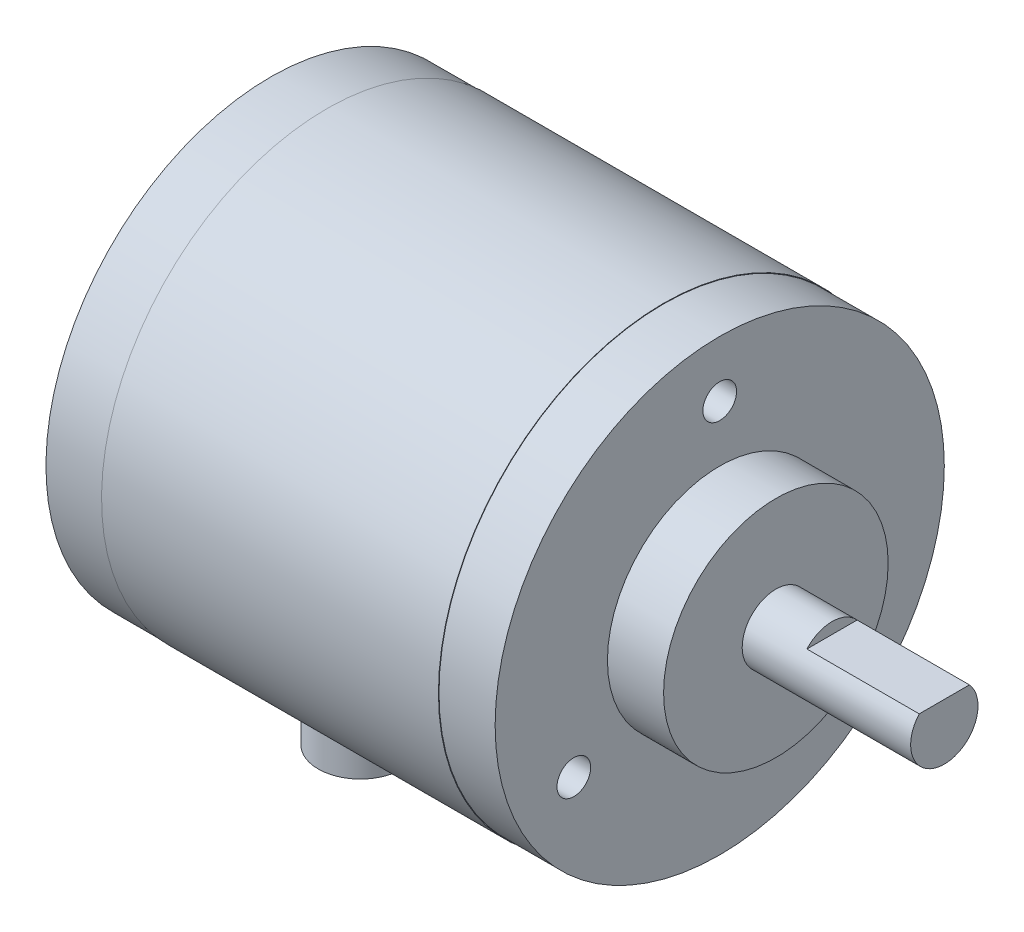
ISO-10303-21;
HEADER;
FILE_DESCRIPTION(('STEP AP214'),'2;1');
FILE_NAME('part.step','',(''),(''),'','','');
FILE_SCHEMA(('AUTOMOTIVE_DESIGN { 1 0 10303 214 1 1 1 1 }'));
ENDSEC;
DATA;
#1=APPLICATION_CONTEXT('core data for automotive mechanical design processes');
#2=APPLICATION_PROTOCOL_DEFINITION('international standard','automotive_design',2000,#1);
#3=PRODUCT_CONTEXT('',#1,'mechanical');
#4=PRODUCT('Part','Part','',(#3));
#5=PRODUCT_RELATED_PRODUCT_CATEGORY('part','',(#4));
#6=PRODUCT_DEFINITION_FORMATION('','',#4);
#7=PRODUCT_DEFINITION_CONTEXT('part definition',#1,'design');
#8=PRODUCT_DEFINITION('design','',#6,#7);
#9=PRODUCT_DEFINITION_SHAPE('','',#8);
#10=(LENGTH_UNIT() NAMED_UNIT(*) SI_UNIT(.MILLI.,.METRE.));
#11=(NAMED_UNIT(*) PLANE_ANGLE_UNIT() SI_UNIT($,.RADIAN.));
#12=(NAMED_UNIT(*) SI_UNIT($,.STERADIAN.) SOLID_ANGLE_UNIT());
#13=UNCERTAINTY_MEASURE_WITH_UNIT(LENGTH_MEASURE(1.E-05),#10,'distance_accuracy_value','');
#14=(GEOMETRIC_REPRESENTATION_CONTEXT(3) GLOBAL_UNCERTAINTY_ASSIGNED_CONTEXT((#13)) GLOBAL_UNIT_ASSIGNED_CONTEXT((#10,
#11,#12)) REPRESENTATION_CONTEXT('',''));
#15=CARTESIAN_POINT('',(0.,0.,0.));
#16=DIRECTION('',(0.,0.,1.));
#17=DIRECTION('',(1.,0.,0.));
#18=AXIS2_PLACEMENT_3D('',#15,#16,#17);
#19=CARTESIAN_POINT('',(5.,0.,0.));
#20=DIRECTION('',(1.,0.,0.));
#21=DIRECTION('',(0.,0.,-1.));
#22=AXIS2_PLACEMENT_3D('',#19,#20,#21);
#23=PLANE('',#22);
#24=DIRECTION('',(0.,-1.,0.));
#25=VECTOR('',#24,1.);
#26=CARTESIAN_POINT('',(5.,-20.,2.25));
#27=LINE('',#26,#25);
#28=CARTESIAN_POINT('',(5.,-19.9233531314385,2.25));
#29=VERTEX_POINT('',#28);
#30=CARTESIAN_POINT('',(5.,-19.8730344940072,2.25));
#31=VERTEX_POINT('',#30);
#32=EDGE_CURVE('E67',#29,#31,#27,.F.);
#33=ORIENTED_EDGE('',*,*,#32,.F.);
#34=CARTESIAN_POINT('',(5.,0.,0.));
#35=DIRECTION('',(1.,0.,0.));
#36=DIRECTION('',(0.,0.,-1.));
#37=AXIS2_PLACEMENT_3D('',#34,#35,#36);
#38=CIRCLE('',#37,20.05);
#39=CARTESIAN_POINT('',(5.,-19.9233531314385,-2.25));
#40=VERTEX_POINT('',#39);
#41=EDGE_CURVE('E91',#40,#29,#38,.T.);
#42=ORIENTED_EDGE('',*,*,#41,.F.);
#43=DIRECTION('',(0.,-1.,0.));
#44=VECTOR('',#43,1.);
#45=CARTESIAN_POINT('',(5.,-20.,-2.25));
#46=LINE('',#45,#44);
#47=CARTESIAN_POINT('',(5.,-19.8730344940072,-2.25));
#48=VERTEX_POINT('',#47);
#49=EDGE_CURVE('E90',#48,#40,#46,.T.);
#50=ORIENTED_EDGE('',*,*,#49,.F.);
#51=CARTESIAN_POINT('',(5.,0.,0.));
#52=DIRECTION('',(1.,0.,0.));
#53=DIRECTION('',(0.,0.,-1.));
#54=AXIS2_PLACEMENT_3D('',#51,#52,#53);
#55=CIRCLE('',#54,20.);
#56=EDGE_CURVE('E54',#48,#31,#55,.T.);
#57=ORIENTED_EDGE('',*,*,#56,.T.);
#58=EDGE_LOOP('',(#33,#42,#50,#57));
#59=FACE_BOUND('',#58,.T.);
#60=ADVANCED_FACE('F41',(#59),#23,.F.);
#61=CARTESIAN_POINT('',(5.,0.,0.));
#62=DIRECTION('',(1.,0.,0.));
#63=DIRECTION('',(0.,0.,-1.));
#64=AXIS2_PLACEMENT_3D('',#61,#62,#63);
#65=CYLINDRICAL_SURFACE('',#64,20.05);
#66=CARTESIAN_POINT('',(35.,0.,0.));
#67=DIRECTION('',(1.,0.,0.));
#68=DIRECTION('',(0.,0.,-1.));
#69=AXIS2_PLACEMENT_3D('',#66,#67,#68);
#70=CIRCLE('',#69,20.05);
#71=CARTESIAN_POINT('',(35.,0.,-20.05));
#72=VERTEX_POINT('',#71);
#73=EDGE_CURVE('E96',#72,#72,#70,.T.);
#74=ORIENTED_EDGE('',*,*,#73,.F.);
#75=EDGE_LOOP('',(#74));
#76=FACE_BOUND('',#75,.T.);
#77=ORIENTED_EDGE('',*,*,#41,.T.);
#78=CARTESIAN_POINT('',(5.,-19.9233531314385,2.25));
#79=CARTESIAN_POINT('',(5.06338252081339,-19.913809537772,2.33452429810005));
#80=CARTESIAN_POINT('',(5.13033387152823,-19.9040233955801,2.41633733781597));
#81=CARTESIAN_POINT('',(5.27087961171765,-19.8842463640926,2.57401230332341));
#82=CARTESIAN_POINT('',(5.34447379216963,-19.8742554812469,2.64987441622589));
#83=CARTESIAN_POINT('',(5.49780582729423,-19.8543498242708,2.79511598565796));
#84=CARTESIAN_POINT('',(5.57754297641999,-19.8444350415432,2.86449618464442));
#85=CARTESIAN_POINT('',(5.74258504125269,-19.8249637662683,2.99628859459913));
#86=CARTESIAN_POINT('',(5.82788988327751,-19.8154072689819,3.05870089774998));
#87=CARTESIAN_POINT('',(6.09143023950738,-19.7876790696918,3.23487693039896));
#88=CARTESIAN_POINT('',(6.27733408485814,-19.7704429159462,3.33761998839842));
#89=CARTESIAN_POINT('',(6.66394335913593,-19.7405148510179,3.51031519580503));
#90=CARTESIAN_POINT('',(6.8646426878523,-19.7278210794988,3.58028077289371));
#91=CARTESIAN_POINT('',(7.2735443129088,-19.7085370662539,3.68495535849222));
#92=CARTESIAN_POINT('',(7.4816690538866,-19.7018962507731,3.71995674132257));
#93=CARTESIAN_POINT('',(7.90096818712595,-19.6953261999385,3.7545909523402));
#94=CARTESIAN_POINT('',(8.11214284751298,-19.6953975583028,3.75422065176326));
#95=CARTESIAN_POINT('',(8.52840995160946,-19.7021950090889,3.71837598671436));
#96=CARTESIAN_POINT('',(8.73354613465909,-19.7088286620763,3.68338924382514));
#97=CARTESIAN_POINT('',(9.13496175001409,-19.7278461700404,3.58012769253164));
#98=CARTESIAN_POINT('',(9.33124146834608,-19.7402298391695,3.51185395999919));
#99=CARTESIAN_POINT('',(9.71046907148457,-19.7694145760612,3.34365462519373));
#100=CARTESIAN_POINT('',(9.89335046224243,-19.7862359898788,3.24358279227224));
#101=CARTESIAN_POINT('',(10.2398917650699,-19.8223955356187,3.01471639303099));
#102=CARTESIAN_POINT('',(10.4035493281158,-19.8417339744975,2.88591832211864));
#103=CARTESIAN_POINT('',(10.7097229897273,-19.8811252716766,2.60083452898006));
#104=CARTESIAN_POINT('',(10.8518633513331,-19.9011845934586,2.44414590207992));
#105=CARTESIAN_POINT('',(11.1079178301332,-19.9394854780099,2.10898579698841));
#106=CARTESIAN_POINT('',(11.221831550984,-19.9577270152526,1.93051401298209));
#107=CARTESIAN_POINT('',(11.4184199666399,-19.9904011004372,1.55618357229031));
#108=CARTESIAN_POINT('',(11.5010123671055,-20.0048235845561,1.36028075965231));
#109=CARTESIAN_POINT('',(11.632007713313,-20.0281625079482,0.957050579316482));
#110=CARTESIAN_POINT('',(11.6804141323141,-20.0370795065614,0.749724374531037));
#111=CARTESIAN_POINT('',(11.7410666399347,-20.0483090645307,0.332695237336482));
#112=CARTESIAN_POINT('',(11.7538180377609,-20.0507138997865,0.123068238703445));
#113=CARTESIAN_POINT('',(11.7442031558044,-20.0489160463769,-0.295341804181988));
#114=CARTESIAN_POINT('',(11.7218388639763,-20.0447137317528,-0.504124895538473));
#115=CARTESIAN_POINT('',(11.6430614161826,-20.0302379912467,-0.913001484824106));
#116=CARTESIAN_POINT('',(11.5869524570755,-20.0200188223739,-1.11315569436244));
#117=CARTESIAN_POINT('',(11.442637609505,-19.9946676878879,-1.50120149177764));
#118=CARTESIAN_POINT('',(11.354429782121,-19.979535425507,-1.68909233808168));
#119=CARTESIAN_POINT('',(11.1474243092731,-19.9458212585601,-2.04934284213158));
#120=CARTESIAN_POINT('',(11.0283323597312,-19.9272066736222,-2.22153025242031));
#121=CARTESIAN_POINT('',(10.7632933448893,-19.8886560989437,-2.5436635211042));
#122=CARTESIAN_POINT('',(10.6173435739289,-19.8687199762009,-2.69360713590529));
#123=CARTESIAN_POINT('',(10.3003165894505,-19.8294333593377,-2.9691330744842));
#124=CARTESIAN_POINT('',(10.1289193627797,-19.8100948000753,-3.09434923922884));
#125=CARTESIAN_POINT('',(9.76724371779164,-19.7744992585008,-3.31423198051181));
#126=CARTESIAN_POINT('',(9.57696609431597,-19.7582421465474,-3.40889984238357));
#127=CARTESIAN_POINT('',(9.18353950999636,-19.7307486025819,-3.56459350080344));
#128=CARTESIAN_POINT('',(8.98043851231735,-19.7194945962094,-3.62573723672984));
#129=CARTESIAN_POINT('',(8.56659724951088,-19.7032567003253,-3.7129738458146));
#130=CARTESIAN_POINT('',(8.35585750734706,-19.6982723824093,-3.73906911382365));
#131=CARTESIAN_POINT('',(7.93630624468577,-19.6951959686927,-3.75523882024993));
#132=CARTESIAN_POINT('',(7.72751707761229,-19.6969959213703,-3.74587743437077));
#133=CARTESIAN_POINT('',(7.31456283978339,-19.7070344679675,-3.69269696640684));
#134=CARTESIAN_POINT('',(7.1103972255991,-19.7152723011273,-3.6488819556783));
#135=CARTESIAN_POINT('',(6.71307270102733,-19.7371963545271,-3.52835409004778));
#136=CARTESIAN_POINT('',(6.51988027552968,-19.7508648374251,-3.45174827259621));
#137=CARTESIAN_POINT('',(6.1489972108003,-19.7821135121085,-3.26789627186293));
#138=CARTESIAN_POINT('',(5.97130916760373,-19.7996943572322,-3.16064497014029));
#139=CARTESIAN_POINT('',(5.65083544225344,-19.8352070966131,-2.92907698683507));
#140=CARTESIAN_POINT('',(5.50635563852822,-19.8529731360342,-2.80708025676274));
#141=CARTESIAN_POINT('',(5.30472216075853,-19.8796395231588,-2.60899927185773));
#142=CARTESIAN_POINT('',(5.24002016141443,-19.8885320184573,-2.54045102381805));
#143=CARTESIAN_POINT('',(5.11594064273755,-19.9061306695084,-2.39866038965758));
#144=CARTESIAN_POINT('',(5.05656361578336,-19.9148368079727,-2.32541757052035));
#145=CARTESIAN_POINT('',(5.,-19.9233531314385,-2.25));
#146=B_SPLINE_CURVE_WITH_KNOTS('',3,(#78,#79,#80,#81,#82,#83,#84,#85,#86,#87,#88,#89,#90,#91,
#92,#93,#94,#95,#96,#97,#98,#99,#100,#101,#102,#103,#104,#105,#106,#107,#108,#109,#110,#111,
#112,#113,#114,#115,#116,#117,#118,#119,#120,#121,#122,#123,#124,#125,#126,#127,#128,#129,#130,
#131,#132,#133,#134,#135,#136,#137,#138,#139,#140,#141,#142,#143,#144,#145),.UNSPECIFIED.,.F.,
.F.,(4,2,2,2,2,2,2,2,2,2,2,2,2,2,2,2,2,2,2,2,2,2,2,2,2,2,2,2,2,2,2,2,2,4),(0.,0.318132871892383,
0.636255736935585,0.954342118490034,1.27242429138438,1.90841449824463,2.54414393589503,
3.17451168300621,3.80493518867032,4.42660292526896,5.04825057022005,5.67279941336149,
6.29742449299743,6.93193873565257,7.56646188731279,8.2026408352407,8.83875513876541,
9.46580748318523,10.0928243304611,10.7142718224244,11.3357568589346,11.9633969702604,
12.5911003447819,13.2274972479982,13.8638673710393,14.4979841106575,15.1320575190755,
15.756084444363,16.3800376399867,17.0019694438269,17.6240051841484,18.1915158424468,
18.4753229303283,18.7591562336995),.UNSPECIFIED.);
#147=EDGE_CURVE('E60',#29,#40,#146,.T.);
#148=ORIENTED_EDGE('',*,*,#147,.T.);
#149=EDGE_LOOP('',(#77,#148));
#150=FACE_BOUND('',#149,.T.);
#151=ADVANCED_FACE('F169',(#76,#150),#65,.T.);
#152=CARTESIAN_POINT('',(40.,0.,0.));
#153=DIRECTION('',(-1.,0.,0.));
#154=DIRECTION('',(0.,0.,1.));
#155=AXIS2_PLACEMENT_3D('',#152,#153,#154);
#156=CYLINDRICAL_SURFACE('',#155,20.);
#157=CARTESIAN_POINT('',(0.,0.,0.));
#158=DIRECTION('',(1.,0.,0.));
#159=DIRECTION('',(0.,0.,-1.));
#160=AXIS2_PLACEMENT_3D('',#157,#158,#159);
#161=CIRCLE('',#160,20.);
#162=CARTESIAN_POINT('',(0.,0.,-20.));
#163=VERTEX_POINT('',#162);
#164=EDGE_CURVE('E146',#163,#163,#161,.T.);
#165=ORIENTED_EDGE('',*,*,#164,.T.);
#166=EDGE_LOOP('',(#165));
#167=FACE_BOUND('',#166,.T.);
#168=CARTESIAN_POINT('',(8.,-19.6452920568771,-3.75));
#169=CARTESIAN_POINT('',(8.20864302003155,-19.6452960948767,-3.74999199708236));
#170=CARTESIAN_POINT('',(8.41738987054657,-19.6486519940172,-3.73252815872372));
#171=CARTESIAN_POINT('',(8.82899740395418,-19.6616962753485,-3.6631813312948));
#172=CARTESIAN_POINT('',(9.03185294106854,-19.6713900293273,-3.61126914421183));
#173=CARTESIAN_POINT('',(9.42566267842735,-19.6959744116249,-3.47467589044478));
#174=CARTESIAN_POINT('',(9.61662777326826,-19.7108601976507,-3.39002534885937));
#175=CARTESIAN_POINT('',(9.98163389821699,-19.7441456580232,-3.19043914400912));
#176=CARTESIAN_POINT('',(10.1556762475082,-19.7625450581403,-3.07550584397982));
#177=CARTESIAN_POINT('',(10.4840754979978,-19.8010403709738,-2.81709197356557));
#178=CARTESIAN_POINT('',(10.6381912086793,-19.821152915642,-2.67330732332729));
#179=CARTESIAN_POINT('',(10.9202609739989,-19.8606614416008,-2.36192944700887));
#180=CARTESIAN_POINT('',(11.048213311062,-19.8800573757788,-2.19433465906236));
#181=CARTESIAN_POINT('',(11.2752484415013,-19.9161254457101,-1.8385097364254));
#182=CARTESIAN_POINT('',(11.3741038337986,-19.9327757013091,-1.65013210008466));
#183=CARTESIAN_POINT('',(11.5386738556838,-19.9612902158233,-1.2590782081269));
#184=CARTESIAN_POINT('',(11.6043912099755,-19.9731548682083,-1.05640312964876));
#185=CARTESIAN_POINT('',(11.7000738715278,-19.9906438780945,-0.645006865468538));
#186=CARTESIAN_POINT('',(11.7304457648067,-19.9963391494082,-0.436383308112141));
#187=CARTESIAN_POINT('',(11.755842219251,-20.0010921153898,-0.0169291900884564));
#188=CARTESIAN_POINT('',(11.7508697903476,-20.0001503752674,0.193901181119177));
#189=CARTESIAN_POINT('',(11.7060305721321,-19.991790844081,0.608995894748492));
#190=CARTESIAN_POINT('',(11.666601576425,-19.9844543061803,0.813309401128675));
#191=CARTESIAN_POINT('',(11.5546608765119,-19.964220658339,1.21236791428869));
#192=CARTESIAN_POINT('',(11.4821479666355,-19.9513233457491,1.40711257206635));
#193=CARTESIAN_POINT('',(11.3056806723542,-19.9212815074335,1.7827751643788));
#194=CARTESIAN_POINT('',(11.2015512802188,-19.9041134397706,1.96360892959633));
#195=CARTESIAN_POINT('',(10.9649358273071,-19.8674286885712,2.3053999430366));
#196=CARTESIAN_POINT('',(10.832446882781,-19.8479117662791,2.46635516727696));
#197=CARTESIAN_POINT('',(10.5404607425412,-19.8083378420142,2.76641404742259));
#198=CARTESIAN_POINT('',(10.3805805402448,-19.7882771475405,2.90514476892603));
#199=CARTESIAN_POINT('',(10.0396261718034,-19.7501627231155,3.15387929628151));
#200=CARTESIAN_POINT('',(9.85855169558841,-19.7321090225338,3.26388268177955));
#201=CARTESIAN_POINT('',(9.47985432324335,-19.700047332678,3.45214630561194));
#202=CARTESIAN_POINT('',(9.28220385702339,-19.6860462632565,3.53035234113553));
#203=CARTESIAN_POINT('',(8.876247039692,-19.6637810599172,3.6523414243764));
#204=CARTESIAN_POINT('',(8.66794189883804,-19.6555162759655,3.6961283725277));
#205=CARTESIAN_POINT('',(8.2499516778603,-19.6457880075251,3.74749181624348));
#206=CARTESIAN_POINT('',(8.04033471108621,-19.6442238954034,3.75560410714647));
#207=CARTESIAN_POINT('',(7.62274136228213,-19.647804785521,3.73682422204311));
#208=CARTESIAN_POINT('',(7.41476489962979,-19.6529494559653,3.70993377716083));
#209=CARTESIAN_POINT('',(7.00811774236403,-19.6692745015801,3.62237170489706));
#210=CARTESIAN_POINT('',(6.80938436843776,-19.680404667272,3.56198096459974));
#211=CARTESIAN_POINT('',(6.42485702567461,-19.7074033539155,3.40943060947649));
#212=CARTESIAN_POINT('',(6.23906401171167,-19.723272224082,3.31726865321987));
#213=CARTESIAN_POINT('',(5.88333095239208,-19.7581894465921,3.1025588279915));
#214=CARTESIAN_POINT('',(5.71359865533482,-19.7772723856329,2.97967249099052));
#215=CARTESIAN_POINT('',(5.39696989946417,-19.8163702842025,2.70745860860616));
#216=CARTESIAN_POINT('',(5.25007549611057,-19.8363853274123,2.55812868582709));
#217=CARTESIAN_POINT('',(4.98129059116469,-19.8754156001486,2.23487354467596));
#218=CARTESIAN_POINT('',(4.85976043348509,-19.8944138958326,2.06064633523972));
#219=CARTESIAN_POINT('',(4.64769698455584,-19.9289851202588,1.69393630760035));
#220=CARTESIAN_POINT('',(4.55716249993749,-19.9445581808681,1.50145419259632));
#221=CARTESIAN_POINT('',(4.4101997553398,-19.9704514498962,1.10469385394671));
#222=CARTESIAN_POINT('',(4.35359453109647,-19.9807988682535,0.90048303269747));
#223=CARTESIAN_POINT('',(4.27553237927529,-19.9951910520937,0.485240568453923));
#224=CARTESIAN_POINT('',(4.25407175334324,-19.9992364807485,0.274209645539619));
#225=CARTESIAN_POINT('',(4.24703674620388,-20.0005556878858,-0.145226900626266));
#226=CARTESIAN_POINT('',(4.26091811717613,-19.997932165625,-0.353623267665643));
#227=CARTESIAN_POINT('',(4.32298106942114,-19.9864216652933,-0.765058423198026));
#228=CARTESIAN_POINT('',(4.37116232186072,-19.9775347472697,-0.968097263034328));
#229=CARTESIAN_POINT('',(4.5002280184591,-19.9544959494482,-1.36276618898861));
#230=CARTESIAN_POINT('',(4.5810545322018,-19.9403533995286,-1.55441579829517));
#231=CARTESIAN_POINT('',(4.77305113413868,-19.9083343017301,-1.92151407829212));
#232=CARTESIAN_POINT('',(4.88422325526933,-19.8904575037025,-2.09696166250962));
#233=CARTESIAN_POINT('',(5.13562863610308,-19.8526194964575,-2.42938756944856));
#234=CARTESIAN_POINT('',(5.27625508464401,-19.8326321146278,-2.58606558847084));
#235=CARTESIAN_POINT('',(5.58176140624202,-19.7929908386248,-2.87378840164262));
#236=CARTESIAN_POINT('',(5.7466469759726,-19.7733370239941,-3.00482715814001));
#237=CARTESIAN_POINT('',(6.09781613672517,-19.7363894350672,-3.23869084861756));
#238=CARTESIAN_POINT('',(6.28428359903574,-19.719119179842,-3.34124351322559));
#239=CARTESIAN_POINT('',(6.67206447481511,-19.6891771141231,-3.51340331051439));
#240=CARTESIAN_POINT('',(6.87336366643841,-19.676500965741,-3.58304154095578));
#241=CARTESIAN_POINT('',(7.22938072018467,-19.6598254076589,-3.67324316491537));
#242=CARTESIAN_POINT('',(7.38201430941024,-19.6544077680446,-3.70197764349923));
#243=CARTESIAN_POINT('',(7.68974617104541,-19.6471396397913,-3.7403587769024));
#244=CARTESIAN_POINT('',(7.84484437624918,-19.6452890540528,-3.75000595130227));
#245=CARTESIAN_POINT('',(8.,-19.6452920568771,-3.75));
#246=B_SPLINE_CURVE_WITH_KNOTS('',3,(#168,#169,#170,#171,#172,#173,#174,#175,#176,#177,#178,
#179,#180,#181,#182,#183,#184,#185,#186,#187,#188,#189,#190,#191,#192,#193,#194,#195,#196,#197,
#198,#199,#200,#201,#202,#203,#204,#205,#206,#207,#208,#209,#210,#211,#212,#213,#214,#215,#216,
#217,#218,#219,#220,#221,#222,#223,#224,#225,#226,#227,#228,#229,#230,#231,#232,#233,#234,#235,
#236,#237,#238,#239,#240,#241,#242,#243,#244,#245),.UNSPECIFIED.,.T.,.F.,(4,2,2,2,2,2,2,2,2,2,2,
2,2,2,2,2,2,2,2,2,2,2,2,2,2,2,2,2,2,2,2,2,2,2,2,2,2,2,4),(0.,0.625361264482966,1.25125325595098,
1.87656306994608,2.5018240998477,3.13405839246727,3.76633417673287,4.40342760870118,
5.04046864849101,5.67010688650652,6.2996915050162,6.92139126496811,7.54311368321061,
8.16834229960548,8.79363452279463,9.4285153691016,10.06340550481,10.6993734029567,
11.3352692216622,11.9615812146769,12.587862233468,13.2089698078842,13.8301231656079,
14.4584465663536,15.0868264848669,15.7236031373968,16.3603552705426,16.9937567354671,
17.6270915416833,18.2507325142534,18.8743675080542,19.4969006632589,20.1194755339277,
20.7509616002186,21.3825961932691,22.0200750454727,22.6569503937719,23.1220076882243,
23.5870523230546),.UNSPECIFIED.);
#247=EDGE_CURVE('E12',#31,#48,#246,.T.);
#248=ORIENTED_EDGE('',*,*,#247,.F.);
#249=ORIENTED_EDGE('',*,*,#56,.F.);
#250=EDGE_LOOP('',(#248,#249));
#251=FACE_BOUND('',#250,.T.);
#252=ADVANCED_FACE('F87',(#167,#251),#156,.T.);
#253=CARTESIAN_POINT('',(35.,0.,0.));
#254=DIRECTION('',(1.,0.,0.));
#255=DIRECTION('',(0.,0.,-1.));
#256=AXIS2_PLACEMENT_3D('',#253,#254,#255);
#257=CIRCLE('',#256,20.);
#258=CARTESIAN_POINT('',(35.,0.,-20.));
#259=VERTEX_POINT('',#258);
#260=EDGE_CURVE('E102',#259,#259,#257,.T.);
#261=ORIENTED_EDGE('',*,*,#260,.T.);
#262=EDGE_LOOP('',(#261));
#263=FACE_BOUND('',#262,.T.);
#264=CARTESIAN_POINT('',(40.,0.,0.));
#265=DIRECTION('',(1.,0.,0.));
#266=DIRECTION('',(0.,0.,-1.));
#267=AXIS2_PLACEMENT_3D('',#264,#265,#266);
#268=CIRCLE('',#267,20.);
#269=CARTESIAN_POINT('',(40.,0.,-20.));
#270=VERTEX_POINT('',#269);
#271=EDGE_CURVE('E88',#270,#270,#268,.T.);
#272=ORIENTED_EDGE('',*,*,#271,.F.);
#273=EDGE_LOOP('',(#272));
#274=FACE_BOUND('',#273,.T.);
#275=ADVANCED_FACE('F43',(#263,#274),#156,.T.);
#276=CARTESIAN_POINT('',(40.,0.,0.));
#277=DIRECTION('',(1.,0.,0.));
#278=DIRECTION('',(0.,0.,-1.));
#279=AXIS2_PLACEMENT_3D('',#276,#277,#278);
#280=PLANE('',#279);
#281=CARTESIAN_POINT('',(40.,-7.49999999999944,-12.9903810567675));
#282=DIRECTION('',(1.,0.,0.));
#283=DIRECTION('',(0.,0.,-1.));
#284=AXIS2_PLACEMENT_3D('',#281,#282,#283);
#285=CIRCLE('',#284,1.50000000000082);
#286=CARTESIAN_POINT('',(40.,-7.49999999999944,-14.4903810567684));
#287=VERTEX_POINT('',#286);
#288=EDGE_CURVE('E129',#287,#287,#285,.T.);
#289=ORIENTED_EDGE('',*,*,#288,.F.);
#290=EDGE_LOOP('',(#289));
#291=FACE_BOUND('',#290,.T.);
#292=CARTESIAN_POINT('',(40.,-7.50000000000056,12.9903810567656));
#293=DIRECTION('',(1.,0.,0.));
#294=DIRECTION('',(0.,0.,-1.));
#295=AXIS2_PLACEMENT_3D('',#292,#293,#294);
#296=CIRCLE('',#295,1.50000000000122);
#297=CARTESIAN_POINT('',(40.,-7.50000000000056,11.4903810567644));
#298=VERTEX_POINT('',#297);
#299=EDGE_CURVE('E122',#298,#298,#296,.T.);
#300=ORIENTED_EDGE('',*,*,#299,.F.);
#301=EDGE_LOOP('',(#300));
#302=FACE_BOUND('',#301,.T.);
#303=CARTESIAN_POINT('',(40.,15.,0.));
#304=DIRECTION('',(1.,0.,0.));
#305=DIRECTION('',(0.,0.,-1.));
#306=AXIS2_PLACEMENT_3D('',#303,#304,#305);
#307=CIRCLE('',#306,1.5);
#308=CARTESIAN_POINT('',(40.,15.,-1.5));
#309=VERTEX_POINT('',#308);
#310=EDGE_CURVE('E128',#309,#309,#307,.T.);
#311=ORIENTED_EDGE('',*,*,#310,.F.);
#312=EDGE_LOOP('',(#311));
#313=FACE_BOUND('',#312,.T.);
#314=CARTESIAN_POINT('',(40.,0.,0.));
#315=DIRECTION('',(1.,0.,0.));
#316=DIRECTION('',(0.,0.,-1.));
#317=AXIS2_PLACEMENT_3D('',#314,#315,#316);
#318=CIRCLE('',#317,10.);
#319=CARTESIAN_POINT('',(40.,0.,-10.));
#320=VERTEX_POINT('',#319);
#321=EDGE_CURVE('E140',#320,#320,#318,.T.);
#322=ORIENTED_EDGE('',*,*,#321,.F.);
#323=EDGE_LOOP('',(#322));
#324=FACE_BOUND('',#323,.T.);
#325=ORIENTED_EDGE('',*,*,#271,.T.);
#326=EDGE_LOOP('',(#325));
#327=FACE_BOUND('',#326,.T.);
#328=ADVANCED_FACE('F222',(#291,#302,#313,#324,#327),#280,.T.);
#329=CARTESIAN_POINT('',(45.,0.,0.));
#330=DIRECTION('',(-1.,0.,0.));
#331=DIRECTION('',(0.,0.,1.));
#332=AXIS2_PLACEMENT_3D('',#329,#330,#331);
#333=CYLINDRICAL_SURFACE('',#332,10.);
#334=CARTESIAN_POINT('',(45.,0.,0.));
#335=DIRECTION('',(1.,0.,0.));
#336=DIRECTION('',(0.,0.,-1.));
#337=AXIS2_PLACEMENT_3D('',#334,#335,#336);
#338=CIRCLE('',#337,10.);
#339=CARTESIAN_POINT('',(45.,0.,-10.));
#340=VERTEX_POINT('',#339);
#341=EDGE_CURVE('E143',#340,#340,#338,.T.);
#342=ORIENTED_EDGE('',*,*,#341,.F.);
#343=EDGE_LOOP('',(#342));
#344=FACE_BOUND('',#343,.T.);
#345=ORIENTED_EDGE('',*,*,#321,.T.);
#346=EDGE_LOOP('',(#345));
#347=FACE_BOUND('',#346,.T.);
#348=ADVANCED_FACE('F219',(#344,#347),#333,.T.);
#349=CARTESIAN_POINT('',(45.,0.,0.));
#350=DIRECTION('',(1.,0.,0.));
#351=DIRECTION('',(0.,0.,-1.));
#352=AXIS2_PLACEMENT_3D('',#349,#350,#351);
#353=PLANE('',#352);
#354=CARTESIAN_POINT('',(45.,0.,0.));
#355=DIRECTION('',(1.,0.,0.));
#356=DIRECTION('',(0.,0.,-1.));
#357=AXIS2_PLACEMENT_3D('',#354,#355,#356);
#358=CIRCLE('',#357,3.);
#359=CARTESIAN_POINT('',(45.,0.,-3.));
#360=VERTEX_POINT('',#359);
#361=EDGE_CURVE('E116',#360,#360,#358,.T.);
#362=ORIENTED_EDGE('',*,*,#361,.F.);
#363=EDGE_LOOP('',(#362));
#364=FACE_BOUND('',#363,.T.);
#365=ORIENTED_EDGE('',*,*,#341,.T.);
#366=EDGE_LOOP('',(#365));
#367=FACE_BOUND('',#366,.T.);
#368=ADVANCED_FACE('F215',(#364,#367),#353,.T.);
#369=CARTESIAN_POINT('',(35.,15.,0.));
#370=DIRECTION('',(1.,0.,0.));
#371=DIRECTION('',(0.,0.,-1.));
#372=AXIS2_PLACEMENT_3D('',#369,#370,#371);
#373=CYLINDRICAL_SURFACE('',#372,1.5);
#374=CARTESIAN_POINT('',(35.,15.,0.));
#375=DIRECTION('',(1.,0.,0.));
#376=DIRECTION('',(0.,0.,-1.));
#377=AXIS2_PLACEMENT_3D('',#374,#375,#376);
#378=CIRCLE('',#377,1.5);
#379=CARTESIAN_POINT('',(35.,15.,-1.5));
#380=VERTEX_POINT('',#379);
#381=EDGE_CURVE('E137',#380,#380,#378,.T.);
#382=ORIENTED_EDGE('',*,*,#381,.F.);
#383=EDGE_LOOP('',(#382));
#384=FACE_BOUND('',#383,.T.);
#385=ORIENTED_EDGE('',*,*,#310,.T.);
#386=EDGE_LOOP('',(#385));
#387=FACE_BOUND('',#386,.T.);
#388=ADVANCED_FACE('F211',(#384,#387),#373,.F.);
#389=CARTESIAN_POINT('',(35.,15.,0.));
#390=DIRECTION('',(1.,0.,0.));
#391=DIRECTION('',(0.,0.,-1.));
#392=AXIS2_PLACEMENT_3D('',#389,#390,#391);
#393=PLANE('',#392);
#394=ORIENTED_EDGE('',*,*,#381,.T.);
#395=EDGE_LOOP('',(#394));
#396=FACE_BOUND('',#395,.T.);
#397=ADVANCED_FACE('F207',(#396),#393,.T.);
#398=CARTESIAN_POINT('',(35.,-7.50000000000056,12.9903810567656));
#399=DIRECTION('',(1.,0.,0.));
#400=DIRECTION('',(0.,0.,-1.));
#401=AXIS2_PLACEMENT_3D('',#398,#399,#400);
#402=CYLINDRICAL_SURFACE('',#401,1.50000000000122);
#403=CARTESIAN_POINT('',(35.,-7.50000000000056,12.9903810567656));
#404=DIRECTION('',(1.,0.,0.));
#405=DIRECTION('',(0.,0.,-1.));
#406=AXIS2_PLACEMENT_3D('',#403,#404,#405);
#407=CIRCLE('',#406,1.50000000000122);
#408=CARTESIAN_POINT('',(35.,-7.50000000000056,11.4903810567644));
#409=VERTEX_POINT('',#408);
#410=EDGE_CURVE('E132',#409,#409,#407,.T.);
#411=ORIENTED_EDGE('',*,*,#410,.F.);
#412=EDGE_LOOP('',(#411));
#413=FACE_BOUND('',#412,.T.);
#414=ORIENTED_EDGE('',*,*,#299,.T.);
#415=EDGE_LOOP('',(#414));
#416=FACE_BOUND('',#415,.T.);
#417=ADVANCED_FACE('F203',(#413,#416),#402,.F.);
#418=CARTESIAN_POINT('',(35.,-7.50000000000056,12.9903810567656));
#419=DIRECTION('',(1.,0.,0.));
#420=DIRECTION('',(0.,0.,-1.));
#421=AXIS2_PLACEMENT_3D('',#418,#419,#420);
#422=PLANE('',#421);
#423=ORIENTED_EDGE('',*,*,#410,.T.);
#424=EDGE_LOOP('',(#423));
#425=FACE_BOUND('',#424,.T.);
#426=ADVANCED_FACE('F199',(#425),#422,.T.);
#427=CARTESIAN_POINT('',(35.,-7.49999999999944,-12.9903810567675));
#428=DIRECTION('',(1.,0.,0.));
#429=DIRECTION('',(0.,0.,-1.));
#430=AXIS2_PLACEMENT_3D('',#427,#428,#429);
#431=CYLINDRICAL_SURFACE('',#430,1.50000000000082);
#432=CARTESIAN_POINT('',(35.,-7.49999999999944,-12.9903810567675));
#433=DIRECTION('',(1.,0.,0.));
#434=DIRECTION('',(0.,0.,-1.));
#435=AXIS2_PLACEMENT_3D('',#432,#433,#434);
#436=CIRCLE('',#435,1.50000000000082);
#437=CARTESIAN_POINT('',(35.,-7.49999999999944,-14.4903810567684));
#438=VERTEX_POINT('',#437);
#439=EDGE_CURVE('E125',#438,#438,#436,.T.);
#440=ORIENTED_EDGE('',*,*,#439,.F.);
#441=EDGE_LOOP('',(#440));
#442=FACE_BOUND('',#441,.T.);
#443=ORIENTED_EDGE('',*,*,#288,.T.);
#444=EDGE_LOOP('',(#443));
#445=FACE_BOUND('',#444,.T.);
#446=ADVANCED_FACE('F195',(#442,#445),#431,.F.);
#447=CARTESIAN_POINT('',(35.,-7.49999999999944,-12.9903810567675));
#448=DIRECTION('',(1.,0.,0.));
#449=DIRECTION('',(0.,0.,-1.));
#450=AXIS2_PLACEMENT_3D('',#447,#448,#449);
#451=PLANE('',#450);
#452=ORIENTED_EDGE('',*,*,#439,.T.);
#453=EDGE_LOOP('',(#452));
#454=FACE_BOUND('',#453,.T.);
#455=ADVANCED_FACE('F191',(#454),#451,.T.);
#456=CARTESIAN_POINT('',(60.,0.,0.));
#457=DIRECTION('',(-1.,0.,0.));
#458=DIRECTION('',(0.,0.,1.));
#459=AXIS2_PLACEMENT_3D('',#456,#457,#458);
#460=CYLINDRICAL_SURFACE('',#459,3.);
#461=CARTESIAN_POINT('',(60.,0.,0.));
#462=DIRECTION('',(1.,0.,0.));
#463=DIRECTION('',(0.,0.,-1.));
#464=AXIS2_PLACEMENT_3D('',#461,#462,#463);
#465=CIRCLE('',#464,3.);
#466=CARTESIAN_POINT('',(60.,2.,2.23606797749979));
#467=VERTEX_POINT('',#466);
#468=CARTESIAN_POINT('',(60.,2.,-2.23606797749979));
#469=VERTEX_POINT('',#468);
#470=EDGE_CURVE('E119',#467,#469,#465,.T.);
#471=ORIENTED_EDGE('',*,*,#470,.F.);
#472=DIRECTION('',(1.,0.,0.));
#473=VECTOR('',#472,1.);
#474=CARTESIAN_POINT('',(50.,2.,2.23606797749979));
#475=LINE('',#474,#473);
#476=CARTESIAN_POINT('',(50.,2.,2.23606797749979));
#477=VERTEX_POINT('',#476);
#478=EDGE_CURVE('E114',#477,#467,#475,.T.);
#479=ORIENTED_EDGE('',*,*,#478,.F.);
#480=CARTESIAN_POINT('',(50.,0.,0.));
#481=DIRECTION('',(1.,0.,0.));
#482=DIRECTION('',(0.,0.,-1.));
#483=AXIS2_PLACEMENT_3D('',#480,#481,#482);
#484=CIRCLE('',#483,3.);
#485=CARTESIAN_POINT('',(50.,2.,-2.23606797749979));
#486=VERTEX_POINT('',#485);
#487=EDGE_CURVE('E109',#486,#477,#484,.T.);
#488=ORIENTED_EDGE('',*,*,#487,.F.);
#489=DIRECTION('',(1.,0.,0.));
#490=VECTOR('',#489,1.);
#491=CARTESIAN_POINT('',(50.,2.,-2.23606797749979));
#492=LINE('',#491,#490);
#493=EDGE_CURVE('E112',#486,#469,#492,.T.);
#494=ORIENTED_EDGE('',*,*,#493,.T.);
#495=EDGE_LOOP('',(#471,#479,#488,#494));
#496=FACE_BOUND('',#495,.T.);
#497=ORIENTED_EDGE('',*,*,#361,.T.);
#498=EDGE_LOOP('',(#497));
#499=FACE_BOUND('',#498,.T.);
#500=ADVANCED_FACE('F187',(#496,#499),#460,.T.);
#501=CARTESIAN_POINT('',(60.,0.,0.));
#502=DIRECTION('',(1.,0.,0.));
#503=DIRECTION('',(0.,0.,-1.));
#504=AXIS2_PLACEMENT_3D('',#501,#502,#503);
#505=PLANE('',#504);
#506=DIRECTION('',(0.,0.,-1.));
#507=VECTOR('',#506,1.);
#508=CARTESIAN_POINT('',(60.,2.,0.));
#509=LINE('',#508,#507);
#510=EDGE_CURVE('E105',#467,#469,#509,.T.);
#511=ORIENTED_EDGE('',*,*,#510,.F.);
#512=ORIENTED_EDGE('',*,*,#470,.T.);
#513=EDGE_LOOP('',(#511,#512));
#514=FACE_BOUND('',#513,.T.);
#515=ADVANCED_FACE('F183',(#514),#505,.T.);
#516=CARTESIAN_POINT('',(50.,2.,0.));
#517=DIRECTION('',(0.,-1.,0.));
#518=DIRECTION('',(0.,0.,-1.));
#519=AXIS2_PLACEMENT_3D('',#516,#517,#518);
#520=PLANE('',#519);
#521=ORIENTED_EDGE('',*,*,#510,.T.);
#522=ORIENTED_EDGE('',*,*,#493,.F.);
#523=DIRECTION('',(0.,0.,-1.));
#524=VECTOR('',#523,1.);
#525=CARTESIAN_POINT('',(50.,2.,0.));
#526=LINE('',#525,#524);
#527=EDGE_CURVE('E106',#477,#486,#526,.T.);
#528=ORIENTED_EDGE('',*,*,#527,.F.);
#529=ORIENTED_EDGE('',*,*,#478,.T.);
#530=EDGE_LOOP('',(#521,#522,#528,#529));
#531=FACE_BOUND('',#530,.T.);
#532=ADVANCED_FACE('F179',(#531),#520,.F.);
#533=CARTESIAN_POINT('',(50.,0.,0.));
#534=DIRECTION('',(1.,0.,0.));
#535=DIRECTION('',(0.,0.,-1.));
#536=AXIS2_PLACEMENT_3D('',#533,#534,#535);
#537=PLANE('',#536);
#538=ORIENTED_EDGE('',*,*,#527,.T.);
#539=ORIENTED_EDGE('',*,*,#487,.T.);
#540=EDGE_LOOP('',(#538,#539));
#541=FACE_BOUND('',#540,.T.);
#542=ADVANCED_FACE('F164',(#541),#537,.T.);
#543=CARTESIAN_POINT('',(35.,0.,0.));
#544=DIRECTION('',(1.,0.,0.));
#545=DIRECTION('',(0.,0.,-1.));
#546=AXIS2_PLACEMENT_3D('',#543,#544,#545);
#547=PLANE('',#546);
#548=ORIENTED_EDGE('',*,*,#73,.T.);
#549=EDGE_LOOP('',(#548));
#550=FACE_BOUND('',#549,.T.);
#551=ORIENTED_EDGE('',*,*,#260,.F.);
#552=EDGE_LOOP('',(#551));
#553=FACE_BOUND('',#552,.T.);
#554=ADVANCED_FACE('F157',(#550,#553),#547,.T.);
#555=CARTESIAN_POINT('',(0.,0.,0.));
#556=DIRECTION('',(1.,0.,0.));
#557=DIRECTION('',(0.,0.,-1.));
#558=AXIS2_PLACEMENT_3D('',#555,#556,#557);
#559=PLANE('',#558);
#560=ORIENTED_EDGE('',*,*,#164,.F.);
#561=EDGE_LOOP('',(#560));
#562=FACE_BOUND('',#561,.T.);
#563=ADVANCED_FACE('F155',(#562),#559,.F.);
#564=CARTESIAN_POINT('',(8.,-20.,0.));
#565=DIRECTION('',(0.,-1.,0.));
#566=DIRECTION('',(0.,0.,-1.));
#567=AXIS2_PLACEMENT_3D('',#564,#565,#566);
#568=CYLINDRICAL_SURFACE('',#567,3.75);
#569=CARTESIAN_POINT('',(8.,-27.5,0.));
#570=DIRECTION('',(0.,1.,0.));
#571=DIRECTION('',(0.,0.,1.));
#572=AXIS2_PLACEMENT_3D('',#569,#570,#571);
#573=CIRCLE('',#572,3.75);
#574=CARTESIAN_POINT('',(8.,-27.5,3.75));
#575=VERTEX_POINT('',#574);
#576=EDGE_CURVE('E391',#575,#575,#573,.T.);
#577=ORIENTED_EDGE('',*,*,#576,.T.);
#578=EDGE_LOOP('',(#577));
#579=FACE_BOUND('',#578,.T.);
#580=ORIENTED_EDGE('',*,*,#147,.F.);
#581=ORIENTED_EDGE('',*,*,#32,.T.);
#582=ORIENTED_EDGE('',*,*,#247,.T.);
#583=ORIENTED_EDGE('',*,*,#49,.T.);
#584=EDGE_LOOP('',(#580,#581,#582,#583));
#585=FACE_BOUND('',#584,.T.);
#586=ADVANCED_FACE('F94',(#579,#585),#568,.T.);
#587=CARTESIAN_POINT('',(0.,-27.5,0.));
#588=DIRECTION('',(0.,1.,0.));
#589=DIRECTION('',(0.,0.,1.));
#590=AXIS2_PLACEMENT_3D('',#587,#588,#589);
#591=PLANE('',#590);
#592=ORIENTED_EDGE('',*,*,#576,.F.);
#593=EDGE_LOOP('',(#592));
#594=FACE_BOUND('',#593,.T.);
#595=ADVANCED_FACE('F162',(#594),#591,.F.);
#596=CLOSED_SHELL('',(#60,#151,#252,#275,#328,#348,#368,#388,#397,#417,#426,#446,#455,#500,#515,
#532,#542,#554,#563,#586,#595));
#597=MANIFOLD_SOLID_BREP('B2',#596);
#598=ADVANCED_BREP_SHAPE_REPRESENTATION('',(#18,#597),#14);
#599=SHAPE_DEFINITION_REPRESENTATION(#9,#598);
ENDSEC;
END-ISO-10303-21;
